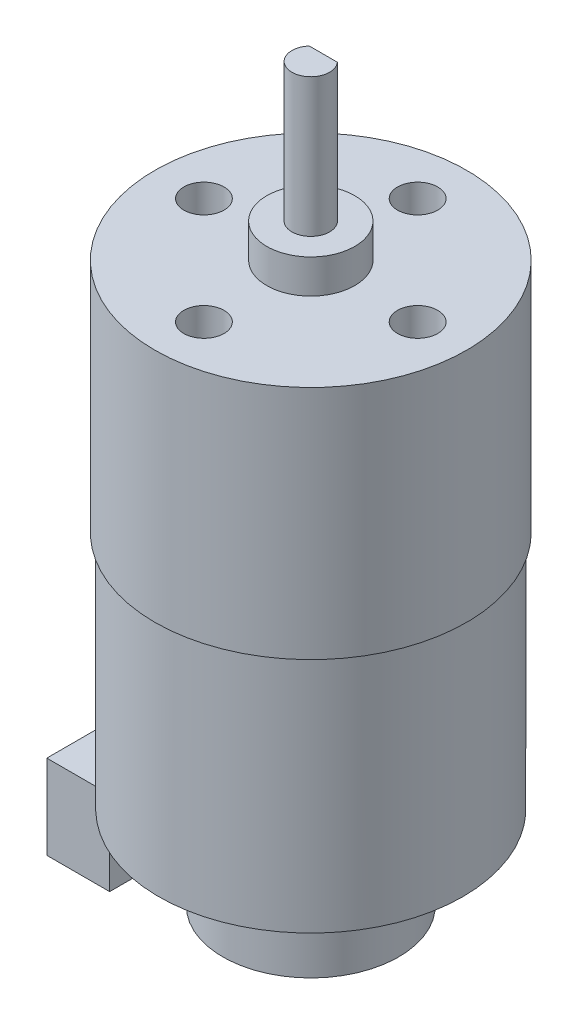
ISO-10303-21;
HEADER;
FILE_DESCRIPTION(('STEP AP214'),'2;1');
FILE_NAME('part.step','',(''),(''),'','','');
FILE_SCHEMA(('AUTOMOTIVE_DESIGN { 1 0 10303 214 1 1 1 1 }'));
ENDSEC;
DATA;
#1=APPLICATION_CONTEXT('core data for automotive mechanical design processes');
#2=APPLICATION_PROTOCOL_DEFINITION('international standard','automotive_design',2000,#1);
#3=PRODUCT_CONTEXT('',#1,'mechanical');
#4=PRODUCT('Part','Part','',(#3));
#5=PRODUCT_RELATED_PRODUCT_CATEGORY('part','',(#4));
#6=PRODUCT_DEFINITION_FORMATION('','',#4);
#7=PRODUCT_DEFINITION_CONTEXT('part definition',#1,'design');
#8=PRODUCT_DEFINITION('design','',#6,#7);
#9=PRODUCT_DEFINITION_SHAPE('','',#8);
#10=(LENGTH_UNIT() NAMED_UNIT(*) SI_UNIT(.MILLI.,.METRE.));
#11=(NAMED_UNIT(*) PLANE_ANGLE_UNIT() SI_UNIT($,.RADIAN.));
#12=(NAMED_UNIT(*) SI_UNIT($,.STERADIAN.) SOLID_ANGLE_UNIT());
#13=UNCERTAINTY_MEASURE_WITH_UNIT(LENGTH_MEASURE(1.E-05),#10,'distance_accuracy_value','');
#14=(GEOMETRIC_REPRESENTATION_CONTEXT(3) GLOBAL_UNCERTAINTY_ASSIGNED_CONTEXT((#13)) GLOBAL_UNIT_ASSIGNED_CONTEXT((#10,
#11,#12)) REPRESENTATION_CONTEXT('',''));
#15=CARTESIAN_POINT('',(0.,0.,0.));
#16=DIRECTION('',(0.,0.,1.));
#17=DIRECTION('',(1.,0.,0.));
#18=AXIS2_PLACEMENT_3D('',#15,#16,#17);
#19=CARTESIAN_POINT('',(0.,0.,0.));
#20=DIRECTION('',(0.,1.,0.));
#21=DIRECTION('',(0.,0.,1.));
#22=AXIS2_PLACEMENT_3D('',#19,#20,#21);
#23=PLANE('',#22);
#24=CARTESIAN_POINT('',(0.,0.,0.));
#25=DIRECTION('',(0.,-1.,0.));
#26=DIRECTION('',(0.,0.,-1.));
#27=AXIS2_PLACEMENT_3D('',#24,#25,#26);
#28=CIRCLE('',#27,7.);
#29=CARTESIAN_POINT('',(0.,0.,-7.));
#30=VERTEX_POINT('',#29);
#31=EDGE_CURVE('E12',#30,#30,#28,.T.);
#32=ORIENTED_EDGE('',*,*,#31,.F.);
#33=EDGE_LOOP('',(#32));
#34=FACE_BOUND('',#33,.T.);
#35=DIRECTION('',(1.,0.,0.));
#36=VECTOR('',#35,1.);
#37=CARTESIAN_POINT('',(-9.,0.,-7.));
#38=LINE('',#37,#36);
#39=CARTESIAN_POINT('',(-9.86965044973731,0.,-7.));
#40=VERTEX_POINT('',#39);
#41=CARTESIAN_POINT('',(-9.,0.,-7.));
#42=VERTEX_POINT('',#41);
#43=EDGE_CURVE('E427',#40,#42,#38,.T.);
#44=ORIENTED_EDGE('',*,*,#43,.F.);
#45=CARTESIAN_POINT('',(0.,0.,0.));
#46=DIRECTION('',(0.,1.,0.));
#47=DIRECTION('',(0.,0.,1.));
#48=AXIS2_PLACEMENT_3D('',#45,#46,#47);
#49=CIRCLE('',#48,12.1);
#50=CARTESIAN_POINT('',(-9.86965044973732,0.,7.));
#51=VERTEX_POINT('',#50);
#52=EDGE_CURVE('E215',#51,#40,#49,.T.);
#53=ORIENTED_EDGE('',*,*,#52,.F.);
#54=DIRECTION('',(-1.,0.,0.));
#55=VECTOR('',#54,1.);
#56=CARTESIAN_POINT('',(-9.,0.,7.));
#57=LINE('',#56,#55);
#58=CARTESIAN_POINT('',(-9.,0.,7.));
#59=VERTEX_POINT('',#58);
#60=EDGE_CURVE('E87',#59,#51,#57,.T.);
#61=ORIENTED_EDGE('',*,*,#60,.F.);
#62=DIRECTION('',(0.,0.,1.));
#63=VECTOR('',#62,1.);
#64=CARTESIAN_POINT('',(-9.,0.,-7.));
#65=LINE('',#64,#63);
#66=EDGE_CURVE('E422',#42,#59,#65,.T.);
#67=ORIENTED_EDGE('',*,*,#66,.F.);
#68=EDGE_LOOP('',(#44,#53,#61,#67));
#69=FACE_BOUND('',#68,.T.);
#70=ADVANCED_FACE('F71',(#34,#69),#23,.F.);
#71=CARTESIAN_POINT('',(0.,19.05,0.));
#72=DIRECTION('',(0.,-1.,0.));
#73=DIRECTION('',(0.,0.,-1.));
#74=AXIS2_PLACEMENT_3D('',#71,#72,#73);
#75=CYLINDRICAL_SURFACE('',#74,12.1);
#76=CARTESIAN_POINT('',(0.,19.05,0.));
#77=DIRECTION('',(0.,1.,0.));
#78=DIRECTION('',(0.,0.,1.));
#79=AXIS2_PLACEMENT_3D('',#76,#77,#78);
#80=CIRCLE('',#79,12.1);
#81=CARTESIAN_POINT('',(0.,19.05,12.1));
#82=VERTEX_POINT('',#81);
#83=EDGE_CURVE('E211',#82,#82,#80,.T.);
#84=ORIENTED_EDGE('',*,*,#83,.F.);
#85=EDGE_LOOP('',(#84));
#86=FACE_BOUND('',#85,.T.);
#87=EDGE_CURVE('E220',#40,#51,#49,.T.);
#88=ORIENTED_EDGE('',*,*,#87,.T.);
#89=ORIENTED_EDGE('',*,*,#52,.T.);
#90=EDGE_LOOP('',(#88,#89));
#91=FACE_BOUND('',#90,.T.);
#92=ADVANCED_FACE('F73',(#86,#91),#75,.T.);
#93=CARTESIAN_POINT('',(0.,37.8,0.));
#94=DIRECTION('',(0.,-1.,0.));
#95=DIRECTION('',(0.,0.,-1.));
#96=AXIS2_PLACEMENT_3D('',#93,#94,#95);
#97=CYLINDRICAL_SURFACE('',#96,12.4);
#98=CARTESIAN_POINT('',(0.,37.8,0.));
#99=DIRECTION('',(0.,1.,0.));
#100=DIRECTION('',(0.,0.,1.));
#101=AXIS2_PLACEMENT_3D('',#98,#99,#100);
#102=CIRCLE('',#101,12.4);
#103=CARTESIAN_POINT('',(0.,37.8,12.4));
#104=VERTEX_POINT('',#103);
#105=EDGE_CURVE('E212',#104,#104,#102,.T.);
#106=ORIENTED_EDGE('',*,*,#105,.F.);
#107=EDGE_LOOP('',(#106));
#108=FACE_BOUND('',#107,.T.);
#109=CARTESIAN_POINT('',(0.,19.05,0.));
#110=DIRECTION('',(0.,1.,0.));
#111=DIRECTION('',(0.,0.,1.));
#112=AXIS2_PLACEMENT_3D('',#109,#110,#111);
#113=CIRCLE('',#112,12.4);
#114=CARTESIAN_POINT('',(0.,19.05,12.4));
#115=VERTEX_POINT('',#114);
#116=EDGE_CURVE('E208',#115,#115,#113,.T.);
#117=ORIENTED_EDGE('',*,*,#116,.T.);
#118=EDGE_LOOP('',(#117));
#119=FACE_BOUND('',#118,.T.);
#120=ADVANCED_FACE('F249',(#108,#119),#97,.T.);
#121=CARTESIAN_POINT('',(0.,37.8,0.));
#122=DIRECTION('',(0.,1.,0.));
#123=DIRECTION('',(0.,0.,1.));
#124=AXIS2_PLACEMENT_3D('',#121,#122,#123);
#125=PLANE('',#124);
#126=CARTESIAN_POINT('',(0.,37.8,-8.5));
#127=DIRECTION('',(0.,1.,0.));
#128=DIRECTION('',(0.,0.,1.));
#129=AXIS2_PLACEMENT_3D('',#126,#127,#128);
#130=CIRCLE('',#129,1.6);
#131=CARTESIAN_POINT('',(0.,37.8,-6.9));
#132=VERTEX_POINT('',#131);
#133=EDGE_CURVE('E178',#132,#132,#130,.T.);
#134=ORIENTED_EDGE('',*,*,#133,.F.);
#135=EDGE_LOOP('',(#134));
#136=FACE_BOUND('',#135,.T.);
#137=CARTESIAN_POINT('',(-8.49999999999976,37.8,2.41064055268796E-13));
#138=DIRECTION('',(0.,1.,0.));
#139=DIRECTION('',(0.,0.,1.));
#140=AXIS2_PLACEMENT_3D('',#137,#138,#139);
#141=CIRCLE('',#140,1.60000000000039);
#142=CARTESIAN_POINT('',(-8.49999999999976,37.8,1.60000000000063));
#143=VERTEX_POINT('',#142);
#144=EDGE_CURVE('E181',#143,#143,#141,.T.);
#145=ORIENTED_EDGE('',*,*,#144,.F.);
#146=EDGE_LOOP('',(#145));
#147=FACE_BOUND('',#146,.T.);
#148=CARTESIAN_POINT('',(4.80046210979042E-13,37.8,8.5));
#149=DIRECTION('',(0.,1.,0.));
#150=DIRECTION('',(0.,0.,1.));
#151=AXIS2_PLACEMENT_3D('',#148,#149,#150);
#152=CIRCLE('',#151,1.60000000000052);
#153=CARTESIAN_POINT('',(4.80046210979042E-13,37.8,10.1000000000005));
#154=VERTEX_POINT('',#153);
#155=EDGE_CURVE('E187',#154,#154,#152,.T.);
#156=ORIENTED_EDGE('',*,*,#155,.F.);
#157=EDGE_LOOP('',(#156));
#158=FACE_BOUND('',#157,.T.);
#159=CARTESIAN_POINT('',(8.50000000000024,37.8,-2.40023105489521E-13));
#160=DIRECTION('',(0.,1.,0.));
#161=DIRECTION('',(0.,0.,1.));
#162=AXIS2_PLACEMENT_3D('',#159,#160,#161);
#163=CIRCLE('',#162,1.60000000000019);
#164=CARTESIAN_POINT('',(8.50000000000024,37.8,1.59999999999995));
#165=VERTEX_POINT('',#164);
#166=EDGE_CURVE('E193',#165,#165,#163,.T.);
#167=ORIENTED_EDGE('',*,*,#166,.F.);
#168=EDGE_LOOP('',(#167));
#169=FACE_BOUND('',#168,.T.);
#170=CARTESIAN_POINT('',(0.,37.8,0.));
#171=DIRECTION('',(0.,1.,0.));
#172=DIRECTION('',(0.,0.,1.));
#173=AXIS2_PLACEMENT_3D('',#170,#171,#172);
#174=CIRCLE('',#173,3.5);
#175=CARTESIAN_POINT('',(0.,37.8,-3.5));
#176=VERTEX_POINT('',#175);
#177=EDGE_CURVE('E205',#176,#176,#174,.T.);
#178=ORIENTED_EDGE('',*,*,#177,.F.);
#179=EDGE_LOOP('',(#178));
#180=FACE_BOUND('',#179,.T.);
#181=ORIENTED_EDGE('',*,*,#105,.T.);
#182=EDGE_LOOP('',(#181));
#183=FACE_BOUND('',#182,.T.);
#184=ADVANCED_FACE('F256',(#136,#147,#158,#169,#180,#183),#125,.T.);
#185=CARTESIAN_POINT('',(0.,19.05,0.));
#186=DIRECTION('',(0.,1.,0.));
#187=DIRECTION('',(0.,0.,1.));
#188=AXIS2_PLACEMENT_3D('',#185,#186,#187);
#189=PLANE('',#188);
#190=ORIENTED_EDGE('',*,*,#83,.T.);
#191=EDGE_LOOP('',(#190));
#192=FACE_BOUND('',#191,.T.);
#193=ORIENTED_EDGE('',*,*,#116,.F.);
#194=EDGE_LOOP('',(#193));
#195=FACE_BOUND('',#194,.T.);
#196=ADVANCED_FACE('F258',(#192,#195),#189,.F.);
#197=CARTESIAN_POINT('',(0.,40.5,0.));
#198=DIRECTION('',(0.,-1.,0.));
#199=DIRECTION('',(0.,0.,-1.));
#200=AXIS2_PLACEMENT_3D('',#197,#198,#199);
#201=CYLINDRICAL_SURFACE('',#200,3.5);
#202=CARTESIAN_POINT('',(0.,40.5,0.));
#203=DIRECTION('',(0.,1.,0.));
#204=DIRECTION('',(0.,0.,1.));
#205=AXIS2_PLACEMENT_3D('',#202,#203,#204);
#206=CIRCLE('',#205,3.5);
#207=CARTESIAN_POINT('',(0.,40.5,-3.5));
#208=VERTEX_POINT('',#207);
#209=EDGE_CURVE('E200',#208,#208,#206,.T.);
#210=CARTESIAN_POINT('',(0.,40.5,-3.5));
#211=CARTESIAN_POINT('',(0.,40.471875,-3.5));
#212=CARTESIAN_POINT('',(0.,40.44375,-3.5));
#213=CARTESIAN_POINT('',(0.,40.3875,-3.5));
#214=CARTESIAN_POINT('',(0.,40.359375,-3.5));
#215=CARTESIAN_POINT('',(0.,40.303125,-3.5));
#216=CARTESIAN_POINT('',(0.,40.275,-3.5));
#217=CARTESIAN_POINT('',(0.,40.21875,-3.5));
#218=CARTESIAN_POINT('',(0.,40.190625,-3.5));
#219=CARTESIAN_POINT('',(0.,40.134375,-3.5));
#220=CARTESIAN_POINT('',(0.,40.10625,-3.5));
#221=CARTESIAN_POINT('',(0.,40.05,-3.5));
#222=CARTESIAN_POINT('',(0.,40.021875,-3.5));
#223=CARTESIAN_POINT('',(0.,39.965625,-3.5));
#224=CARTESIAN_POINT('',(0.,39.9375,-3.5));
#225=CARTESIAN_POINT('',(0.,39.88125,-3.5));
#226=CARTESIAN_POINT('',(0.,39.853125,-3.5));
#227=CARTESIAN_POINT('',(0.,39.796875,-3.5));
#228=CARTESIAN_POINT('',(0.,39.76875,-3.5));
#229=CARTESIAN_POINT('',(0.,39.7125,-3.5));
#230=CARTESIAN_POINT('',(0.,39.684375,-3.5));
#231=CARTESIAN_POINT('',(0.,39.628125,-3.5));
#232=CARTESIAN_POINT('',(0.,39.6,-3.5));
#233=CARTESIAN_POINT('',(0.,39.54375,-3.5));
#234=CARTESIAN_POINT('',(0.,39.515625,-3.5));
#235=CARTESIAN_POINT('',(0.,39.459375,-3.5));
#236=CARTESIAN_POINT('',(0.,39.43125,-3.5));
#237=CARTESIAN_POINT('',(0.,39.375,-3.5));
#238=CARTESIAN_POINT('',(0.,39.346875,-3.5));
#239=CARTESIAN_POINT('',(0.,39.290625,-3.5));
#240=CARTESIAN_POINT('',(0.,39.2625,-3.5));
#241=CARTESIAN_POINT('',(0.,39.20625,-3.5));
#242=CARTESIAN_POINT('',(0.,39.178125,-3.5));
#243=CARTESIAN_POINT('',(0.,39.121875,-3.5));
#244=CARTESIAN_POINT('',(0.,39.09375,-3.5));
#245=CARTESIAN_POINT('',(0.,39.0375,-3.5));
#246=CARTESIAN_POINT('',(0.,39.009375,-3.5));
#247=CARTESIAN_POINT('',(0.,38.953125,-3.5));
#248=CARTESIAN_POINT('',(0.,38.925,-3.5));
#249=CARTESIAN_POINT('',(0.,38.86875,-3.5));
#250=CARTESIAN_POINT('',(0.,38.840625,-3.5));
#251=CARTESIAN_POINT('',(0.,38.784375,-3.5));
#252=CARTESIAN_POINT('',(0.,38.75625,-3.5));
#253=CARTESIAN_POINT('',(0.,38.7,-3.5));
#254=CARTESIAN_POINT('',(0.,38.671875,-3.5));
#255=CARTESIAN_POINT('',(0.,38.615625,-3.5));
#256=CARTESIAN_POINT('',(0.,38.5875,-3.5));
#257=CARTESIAN_POINT('',(0.,38.53125,-3.5));
#258=CARTESIAN_POINT('',(0.,38.503125,-3.5));
#259=CARTESIAN_POINT('',(0.,38.446875,-3.5));
#260=CARTESIAN_POINT('',(0.,38.41875,-3.5));
#261=CARTESIAN_POINT('',(0.,38.3625,-3.5));
#262=CARTESIAN_POINT('',(0.,38.334375,-3.5));
#263=CARTESIAN_POINT('',(0.,38.278125,-3.5));
#264=CARTESIAN_POINT('',(0.,38.25,-3.5));
#265=CARTESIAN_POINT('',(0.,38.19375,-3.5));
#266=CARTESIAN_POINT('',(0.,38.165625,-3.5));
#267=CARTESIAN_POINT('',(0.,38.109375,-3.5));
#268=CARTESIAN_POINT('',(0.,38.08125,-3.5));
#269=CARTESIAN_POINT('',(0.,38.025,-3.5));
#270=CARTESIAN_POINT('',(0.,37.996875,-3.5));
#271=CARTESIAN_POINT('',(0.,37.940625,-3.5));
#272=CARTESIAN_POINT('',(0.,37.9125,-3.5));
#273=CARTESIAN_POINT('',(0.,37.85625,-3.5));
#274=CARTESIAN_POINT('',(0.,37.828125,-3.5));
#275=CARTESIAN_POINT('',(0.,37.8,-3.5));
#276=B_SPLINE_CURVE_WITH_KNOTS('',3,(#210,#211,#212,#213,#214,#215,#216,#217,#218,#219,#220,
#221,#222,#223,#224,#225,#226,#227,#228,#229,#230,#231,#232,#233,#234,#235,#236,#237,#238,#239,
#240,#241,#242,#243,#244,#245,#246,#247,#248,#249,#250,#251,#252,#253,#254,#255,#256,#257,#258,
#259,#260,#261,#262,#263,#264,#265,#266,#267,#268,#269,#270,#271,#272,#273,#274,#275),
.UNSPECIFIED.,.F.,.F.,(4,2,2,2,2,2,2,2,2,2,2,2,2,2,2,2,2,2,2,2,2,2,2,2,2,2,2,2,2,2,2,2,4),(0.,
0.0843750000000046,0.168750000000002,0.253125000000007,0.337500000000004,0.421875000000002,
0.506250000000007,0.590625000000004,0.675000000000002,0.759375000000007,0.843750000000004,
0.928125000000002,1.01250000000001,1.096875,1.18125,1.26562500000001,1.35,1.434375,
1.51875000000001,1.603125,1.6875,1.77187500000001,1.85625,1.940625,2.02500000000001,2.109375,
2.19375,2.27812500000001,2.3625,2.44687500000001,2.53125000000001,2.615625,2.70000000000001),.UNSPECIFIED.);
#277=EDGE_CURVE('BSEAM261',#208,#176,#276,.T.);
#278=ORIENTED_EDGE('',*,*,#209,.F.);
#279=ORIENTED_EDGE('',*,*,#177,.T.);
#280=ORIENTED_EDGE('',*,*,#277,.T.);
#281=ORIENTED_EDGE('',*,*,#277,.F.);
#282=EDGE_LOOP('',(#278,#280,#279,#281));
#283=FACE_BOUND('',#282,.T.);
#284=ADVANCED_FACE('F261',(#283),#201,.T.);
#285=CARTESIAN_POINT('',(0.,40.5,0.));
#286=DIRECTION('',(0.,1.,0.));
#287=DIRECTION('',(0.,0.,1.));
#288=AXIS2_PLACEMENT_3D('',#285,#286,#287);
#289=PLANE('',#288);
#290=CARTESIAN_POINT('',(0.,40.5,0.));
#291=DIRECTION('',(0.,1.,0.));
#292=DIRECTION('',(0.,0.,1.));
#293=AXIS2_PLACEMENT_3D('',#290,#291,#292);
#294=CIRCLE('',#293,1.5);
#295=CARTESIAN_POINT('',(0.,40.5,1.5));
#296=VERTEX_POINT('',#295);
#297=EDGE_CURVE('E201',#296,#296,#294,.T.);
#298=ORIENTED_EDGE('',*,*,#297,.F.);
#299=EDGE_LOOP('',(#298));
#300=FACE_BOUND('',#299,.T.);
#301=ORIENTED_EDGE('',*,*,#209,.T.);
#302=EDGE_LOOP('',(#301));
#303=FACE_BOUND('',#302,.T.);
#304=ADVANCED_FACE('F268',(#300,#303),#289,.T.);
#305=CARTESIAN_POINT('',(0.,51.5,0.));
#306=DIRECTION('',(0.,-1.,0.));
#307=DIRECTION('',(0.,0.,-1.));
#308=AXIS2_PLACEMENT_3D('',#305,#306,#307);
#309=CYLINDRICAL_SURFACE('',#308,1.5);
#310=CARTESIAN_POINT('',(0.,51.5,0.));
#311=DIRECTION('',(0.,1.,0.));
#312=DIRECTION('',(0.,0.,1.));
#313=AXIS2_PLACEMENT_3D('',#310,#311,#312);
#314=CIRCLE('',#313,1.5);
#315=CARTESIAN_POINT('',(-1.1180339887499,51.5,-1.));
#316=VERTEX_POINT('',#315);
#317=CARTESIAN_POINT('',(1.1180339887499,51.5,-1.));
#318=VERTEX_POINT('',#317);
#319=EDGE_CURVE('E177',#316,#318,#314,.T.);
#320=ORIENTED_EDGE('',*,*,#319,.F.);
#321=DIRECTION('',(0.,-1.,0.));
#322=VECTOR('',#321,1.);
#323=CARTESIAN_POINT('',(-1.1180339887499,51.5,-1.));
#324=LINE('',#323,#322);
#325=CARTESIAN_POINT('',(-1.1180339887499,43.5,-1.));
#326=VERTEX_POINT('',#325);
#327=EDGE_CURVE('E95',#316,#326,#324,.T.);
#328=ORIENTED_EDGE('',*,*,#327,.T.);
#329=CARTESIAN_POINT('',(0.,43.5,0.));
#330=DIRECTION('',(0.,-1.,0.));
#331=DIRECTION('',(0.,0.,-1.));
#332=AXIS2_PLACEMENT_3D('',#329,#330,#331);
#333=CIRCLE('',#332,1.5);
#334=CARTESIAN_POINT('',(1.1180339887499,43.5,-1.));
#335=VERTEX_POINT('',#334);
#336=EDGE_CURVE('E75',#326,#335,#333,.T.);
#337=ORIENTED_EDGE('',*,*,#336,.T.);
#338=DIRECTION('',(0.,-1.,0.));
#339=VECTOR('',#338,1.);
#340=CARTESIAN_POINT('',(1.1180339887499,51.5,-1.));
#341=LINE('',#340,#339);
#342=EDGE_CURVE('E169',#335,#318,#341,.F.);
#343=ORIENTED_EDGE('',*,*,#342,.T.);
#344=EDGE_LOOP('',(#320,#328,#337,#343));
#345=FACE_BOUND('',#344,.T.);
#346=ORIENTED_EDGE('',*,*,#297,.T.);
#347=EDGE_LOOP('',(#346));
#348=FACE_BOUND('',#347,.T.);
#349=ADVANCED_FACE('F225',(#345,#348),#309,.T.);
#350=CARTESIAN_POINT('',(0.,51.5,0.));
#351=DIRECTION('',(0.,1.,0.));
#352=DIRECTION('',(0.,0.,1.));
#353=AXIS2_PLACEMENT_3D('',#350,#351,#352);
#354=PLANE('',#353);
#355=DIRECTION('',(1.,0.,0.));
#356=VECTOR('',#355,1.);
#357=CARTESIAN_POINT('',(0.,51.5,-1.));
#358=LINE('',#357,#356);
#359=EDGE_CURVE('E204',#316,#318,#358,.T.);
#360=ORIENTED_EDGE('',*,*,#359,.F.);
#361=ORIENTED_EDGE('',*,*,#319,.T.);
#362=EDGE_LOOP('',(#360,#361));
#363=FACE_BOUND('',#362,.T.);
#364=ADVANCED_FACE('F275',(#363),#354,.T.);
#365=CARTESIAN_POINT('',(8.50000000000024,30.8,-2.40023105489521E-13));
#366=DIRECTION('',(0.,1.,0.));
#367=DIRECTION('',(0.,0.,1.));
#368=AXIS2_PLACEMENT_3D('',#365,#366,#367);
#369=CYLINDRICAL_SURFACE('',#368,1.60000000000019);
#370=CARTESIAN_POINT('',(8.50000000000024,30.8,-2.40023105489521E-13));
#371=DIRECTION('',(0.,1.,0.));
#372=DIRECTION('',(0.,0.,1.));
#373=AXIS2_PLACEMENT_3D('',#370,#371,#372);
#374=CIRCLE('',#373,1.60000000000019);
#375=CARTESIAN_POINT('',(8.50000000000024,30.8,1.59999999999995));
#376=VERTEX_POINT('',#375);
#377=EDGE_CURVE('E173',#376,#376,#374,.T.);
#378=ORIENTED_EDGE('',*,*,#377,.F.);
#379=EDGE_LOOP('',(#378));
#380=FACE_BOUND('',#379,.T.);
#381=ORIENTED_EDGE('',*,*,#166,.T.);
#382=EDGE_LOOP('',(#381));
#383=FACE_BOUND('',#382,.T.);
#384=ADVANCED_FACE('F278',(#380,#383),#369,.F.);
#385=CARTESIAN_POINT('',(8.50000000000024,30.8,-2.40023105489521E-13));
#386=DIRECTION('',(0.,1.,0.));
#387=DIRECTION('',(0.,0.,1.));
#388=AXIS2_PLACEMENT_3D('',#385,#386,#387);
#389=PLANE('',#388);
#390=ORIENTED_EDGE('',*,*,#377,.T.);
#391=EDGE_LOOP('',(#390));
#392=FACE_BOUND('',#391,.T.);
#393=ADVANCED_FACE('F280',(#392),#389,.T.);
#394=CARTESIAN_POINT('',(4.80046210979042E-13,30.8,8.5));
#395=DIRECTION('',(0.,1.,0.));
#396=DIRECTION('',(0.,0.,1.));
#397=AXIS2_PLACEMENT_3D('',#394,#395,#396);
#398=CYLINDRICAL_SURFACE('',#397,1.60000000000052);
#399=CARTESIAN_POINT('',(4.80046210979042E-13,30.8,8.5));
#400=DIRECTION('',(0.,1.,0.));
#401=DIRECTION('',(0.,0.,1.));
#402=AXIS2_PLACEMENT_3D('',#399,#400,#401);
#403=CIRCLE('',#402,1.60000000000052);
#404=CARTESIAN_POINT('',(4.80046210979042E-13,30.8,10.1000000000005));
#405=VERTEX_POINT('',#404);
#406=EDGE_CURVE('E190',#405,#405,#403,.T.);
#407=ORIENTED_EDGE('',*,*,#406,.F.);
#408=EDGE_LOOP('',(#407));
#409=FACE_BOUND('',#408,.T.);
#410=ORIENTED_EDGE('',*,*,#155,.T.);
#411=EDGE_LOOP('',(#410));
#412=FACE_BOUND('',#411,.T.);
#413=ADVANCED_FACE('F283',(#409,#412),#398,.F.);
#414=CARTESIAN_POINT('',(4.80046210979042E-13,30.8,8.5));
#415=DIRECTION('',(0.,1.,0.));
#416=DIRECTION('',(0.,0.,1.));
#417=AXIS2_PLACEMENT_3D('',#414,#415,#416);
#418=PLANE('',#417);
#419=ORIENTED_EDGE('',*,*,#406,.T.);
#420=EDGE_LOOP('',(#419));
#421=FACE_BOUND('',#420,.T.);
#422=ADVANCED_FACE('F288',(#421),#418,.T.);
#423=CARTESIAN_POINT('',(-8.49999999999976,30.8,2.41064055268796E-13));
#424=DIRECTION('',(0.,1.,0.));
#425=DIRECTION('',(0.,0.,1.));
#426=AXIS2_PLACEMENT_3D('',#423,#424,#425);
#427=CYLINDRICAL_SURFACE('',#426,1.60000000000039);
#428=CARTESIAN_POINT('',(-8.49999999999976,30.8,2.41064055268796E-13));
#429=DIRECTION('',(0.,1.,0.));
#430=DIRECTION('',(0.,0.,1.));
#431=AXIS2_PLACEMENT_3D('',#428,#429,#430);
#432=CIRCLE('',#431,1.60000000000039);
#433=CARTESIAN_POINT('',(-8.49999999999976,30.8,1.60000000000063));
#434=VERTEX_POINT('',#433);
#435=EDGE_CURVE('E184',#434,#434,#432,.T.);
#436=ORIENTED_EDGE('',*,*,#435,.F.);
#437=EDGE_LOOP('',(#436));
#438=FACE_BOUND('',#437,.T.);
#439=ORIENTED_EDGE('',*,*,#144,.T.);
#440=EDGE_LOOP('',(#439));
#441=FACE_BOUND('',#440,.T.);
#442=ADVANCED_FACE('F291',(#438,#441),#427,.F.);
#443=CARTESIAN_POINT('',(-8.49999999999976,30.8,2.41064055268796E-13));
#444=DIRECTION('',(0.,1.,0.));
#445=DIRECTION('',(0.,0.,1.));
#446=AXIS2_PLACEMENT_3D('',#443,#444,#445);
#447=PLANE('',#446);
#448=ORIENTED_EDGE('',*,*,#435,.T.);
#449=EDGE_LOOP('',(#448));
#450=FACE_BOUND('',#449,.T.);
#451=ADVANCED_FACE('F296',(#450),#447,.T.);
#452=CARTESIAN_POINT('',(0.,30.8,-8.5));
#453=DIRECTION('',(0.,1.,0.));
#454=DIRECTION('',(0.,0.,1.));
#455=AXIS2_PLACEMENT_3D('',#452,#453,#454);
#456=CYLINDRICAL_SURFACE('',#455,1.6);
#457=CARTESIAN_POINT('',(0.,30.8,-8.5));
#458=DIRECTION('',(0.,1.,0.));
#459=DIRECTION('',(0.,0.,1.));
#460=AXIS2_PLACEMENT_3D('',#457,#458,#459);
#461=CIRCLE('',#460,1.6);
#462=CARTESIAN_POINT('',(0.,30.8,-6.9));
#463=VERTEX_POINT('',#462);
#464=EDGE_CURVE('E174',#463,#463,#461,.T.);
#465=ORIENTED_EDGE('',*,*,#464,.F.);
#466=EDGE_LOOP('',(#465));
#467=FACE_BOUND('',#466,.T.);
#468=ORIENTED_EDGE('',*,*,#133,.T.);
#469=EDGE_LOOP('',(#468));
#470=FACE_BOUND('',#469,.T.);
#471=ADVANCED_FACE('F299',(#467,#470),#456,.F.);
#472=CARTESIAN_POINT('',(0.,30.8,-8.5));
#473=DIRECTION('',(0.,1.,0.));
#474=DIRECTION('',(0.,0.,1.));
#475=AXIS2_PLACEMENT_3D('',#472,#473,#474);
#476=PLANE('',#475);
#477=ORIENTED_EDGE('',*,*,#464,.T.);
#478=EDGE_LOOP('',(#477));
#479=FACE_BOUND('',#478,.T.);
#480=ADVANCED_FACE('F241',(#479),#476,.T.);
#481=CARTESIAN_POINT('',(0.,43.5,0.));
#482=DIRECTION('',(0.,-1.,0.));
#483=DIRECTION('',(0.,0.,-1.));
#484=AXIS2_PLACEMENT_3D('',#481,#482,#483);
#485=PLANE('',#484);
#486=DIRECTION('',(1.,0.,0.));
#487=VECTOR('',#486,1.);
#488=CARTESIAN_POINT('',(-2.56178423388724,43.5,-1.));
#489=LINE('',#488,#487);
#490=EDGE_CURVE('E161',#326,#335,#489,.T.);
#491=ORIENTED_EDGE('',*,*,#490,.T.);
#492=ORIENTED_EDGE('',*,*,#336,.F.);
#493=EDGE_LOOP('',(#491,#492));
#494=FACE_BOUND('',#493,.T.);
#495=ADVANCED_FACE('F228',(#494),#485,.F.);
#496=CARTESIAN_POINT('',(-2.56178423388724,43.5,-1.));
#497=DIRECTION('',(0.,0.,1.));
#498=DIRECTION('',(1.,0.,0.));
#499=AXIS2_PLACEMENT_3D('',#496,#497,#498);
#500=PLANE('',#499);
#501=ORIENTED_EDGE('',*,*,#359,.T.);
#502=ORIENTED_EDGE('',*,*,#342,.F.);
#503=ORIENTED_EDGE('',*,*,#490,.F.);
#504=ORIENTED_EDGE('',*,*,#327,.F.);
#505=EDGE_LOOP('',(#501,#502,#503,#504));
#506=FACE_BOUND('',#505,.T.);
#507=ADVANCED_FACE('F229',(#506),#500,.F.);
#508=CARTESIAN_POINT('',(0.,-6.7,0.));
#509=DIRECTION('',(0.,1.,0.));
#510=DIRECTION('',(0.,0.,1.));
#511=AXIS2_PLACEMENT_3D('',#508,#509,#510);
#512=CYLINDRICAL_SURFACE('',#511,7.);
#513=CARTESIAN_POINT('',(0.,-6.7,0.));
#514=DIRECTION('',(0.,-1.,0.));
#515=DIRECTION('',(0.,0.,-1.));
#516=AXIS2_PLACEMENT_3D('',#513,#514,#515);
#517=CIRCLE('',#516,7.);
#518=CARTESIAN_POINT('',(0.,-6.7,-7.));
#519=VERTEX_POINT('',#518);
#520=EDGE_CURVE('E158',#519,#519,#517,.T.);
#521=ORIENTED_EDGE('',*,*,#520,.F.);
#522=EDGE_LOOP('',(#521));
#523=FACE_BOUND('',#522,.T.);
#524=ORIENTED_EDGE('',*,*,#31,.T.);
#525=EDGE_LOOP('',(#524));
#526=FACE_BOUND('',#525,.T.);
#527=ADVANCED_FACE('F231',(#523,#526),#512,.T.);
#528=CARTESIAN_POINT('',(0.,-6.7,0.));
#529=DIRECTION('',(0.,-1.,0.));
#530=DIRECTION('',(0.,0.,-1.));
#531=AXIS2_PLACEMENT_3D('',#528,#529,#530);
#532=PLANE('',#531);
#533=ORIENTED_EDGE('',*,*,#520,.T.);
#534=EDGE_LOOP('',(#533));
#535=FACE_BOUND('',#534,.T.);
#536=ADVANCED_FACE('F238',(#535),#532,.T.);
#537=CARTESIAN_POINT('',(-14.,-6.7,-7.));
#538=DIRECTION('',(1.,0.,0.));
#539=DIRECTION('',(0.,0.,-1.));
#540=AXIS2_PLACEMENT_3D('',#537,#538,#539);
#541=PLANE('',#540);
#542=DIRECTION('',(0.,0.,-1.));
#543=VECTOR('',#542,1.);
#544=CARTESIAN_POINT('',(-14.,0.,-7.));
#545=LINE('',#544,#543);
#546=CARTESIAN_POINT('',(-14.,0.,7.));
#547=VERTEX_POINT('',#546);
#548=CARTESIAN_POINT('',(-14.,0.,-7.));
#549=VERTEX_POINT('',#548);
#550=EDGE_CURVE('E157',#547,#549,#545,.T.);
#551=ORIENTED_EDGE('',*,*,#550,.T.);
#552=DIRECTION('',(0.,1.,0.));
#553=VECTOR('',#552,1.);
#554=CARTESIAN_POINT('',(-14.,-6.7,-7.));
#555=LINE('',#554,#553);
#556=CARTESIAN_POINT('',(-14.,-6.7,-7.));
#557=VERTEX_POINT('',#556);
#558=EDGE_CURVE('E138',#557,#549,#555,.T.);
#559=ORIENTED_EDGE('',*,*,#558,.F.);
#560=DIRECTION('',(0.,0.,-1.));
#561=VECTOR('',#560,1.);
#562=CARTESIAN_POINT('',(-14.,-6.7,-7.));
#563=LINE('',#562,#561);
#564=CARTESIAN_POINT('',(-14.,-6.7,7.));
#565=VERTEX_POINT('',#564);
#566=EDGE_CURVE('E145',#565,#557,#563,.T.);
#567=ORIENTED_EDGE('',*,*,#566,.F.);
#568=DIRECTION('',(0.,1.,0.));
#569=VECTOR('',#568,1.);
#570=CARTESIAN_POINT('',(-14.,-6.7,7.));
#571=LINE('',#570,#569);
#572=EDGE_CURVE('E435',#565,#547,#571,.T.);
#573=ORIENTED_EDGE('',*,*,#572,.T.);
#574=EDGE_LOOP('',(#551,#559,#567,#573));
#575=FACE_BOUND('',#574,.T.);
#576=ADVANCED_FACE('F155',(#575),#541,.F.);
#577=CARTESIAN_POINT('',(-9.,-6.7,-7.));
#578=DIRECTION('',(0.,0.,1.));
#579=DIRECTION('',(1.,0.,0.));
#580=AXIS2_PLACEMENT_3D('',#577,#578,#579);
#581=PLANE('',#580);
#582=EDGE_CURVE('E429',#549,#40,#38,.T.);
#583=ORIENTED_EDGE('',*,*,#582,.T.);
#584=ORIENTED_EDGE('',*,*,#43,.T.);
#585=DIRECTION('',(0.,1.,0.));
#586=VECTOR('',#585,1.);
#587=CARTESIAN_POINT('',(-9.,-6.7,-7.));
#588=LINE('',#587,#586);
#589=CARTESIAN_POINT('',(-9.,-6.7,-7.));
#590=VERTEX_POINT('',#589);
#591=EDGE_CURVE('E141',#590,#42,#588,.T.);
#592=ORIENTED_EDGE('',*,*,#591,.F.);
#593=DIRECTION('',(1.,0.,0.));
#594=VECTOR('',#593,1.);
#595=CARTESIAN_POINT('',(-9.,-6.7,-7.));
#596=LINE('',#595,#594);
#597=EDGE_CURVE('E133',#557,#590,#596,.T.);
#598=ORIENTED_EDGE('',*,*,#597,.F.);
#599=ORIENTED_EDGE('',*,*,#558,.T.);
#600=EDGE_LOOP('',(#583,#584,#592,#598,#599));
#601=FACE_BOUND('',#600,.T.);
#602=ADVANCED_FACE('F136',(#601),#581,.F.);
#603=CARTESIAN_POINT('',(-9.,-6.7,-7.));
#604=DIRECTION('',(-1.,0.,0.));
#605=DIRECTION('',(0.,0.,1.));
#606=AXIS2_PLACEMENT_3D('',#603,#604,#605);
#607=PLANE('',#606);
#608=ORIENTED_EDGE('',*,*,#66,.T.);
#609=DIRECTION('',(0.,1.,0.));
#610=VECTOR('',#609,1.);
#611=CARTESIAN_POINT('',(-9.,-6.7,7.));
#612=LINE('',#611,#610);
#613=CARTESIAN_POINT('',(-9.,-6.7,7.));
#614=VERTEX_POINT('',#613);
#615=EDGE_CURVE('E163',#614,#59,#612,.T.);
#616=ORIENTED_EDGE('',*,*,#615,.F.);
#617=DIRECTION('',(0.,0.,1.));
#618=VECTOR('',#617,1.);
#619=CARTESIAN_POINT('',(-9.,-6.7,-7.));
#620=LINE('',#619,#618);
#621=EDGE_CURVE('E144',#590,#614,#620,.T.);
#622=ORIENTED_EDGE('',*,*,#621,.F.);
#623=ORIENTED_EDGE('',*,*,#591,.T.);
#624=EDGE_LOOP('',(#608,#616,#622,#623));
#625=FACE_BOUND('',#624,.T.);
#626=ADVANCED_FACE('F378',(#625),#607,.F.);
#627=CARTESIAN_POINT('',(-9.,-6.7,7.));
#628=DIRECTION('',(0.,0.,-1.));
#629=DIRECTION('',(-1.,0.,0.));
#630=AXIS2_PLACEMENT_3D('',#627,#628,#629);
#631=PLANE('',#630);
#632=ORIENTED_EDGE('',*,*,#60,.T.);
#633=EDGE_CURVE('E420',#51,#547,#57,.T.);
#634=ORIENTED_EDGE('',*,*,#633,.T.);
#635=ORIENTED_EDGE('',*,*,#572,.F.);
#636=DIRECTION('',(-1.,0.,0.));
#637=VECTOR('',#636,1.);
#638=CARTESIAN_POINT('',(-9.,-6.7,7.));
#639=LINE('',#638,#637);
#640=EDGE_CURVE('E150',#614,#565,#639,.T.);
#641=ORIENTED_EDGE('',*,*,#640,.F.);
#642=ORIENTED_EDGE('',*,*,#615,.T.);
#643=EDGE_LOOP('',(#632,#634,#635,#641,#642));
#644=FACE_BOUND('',#643,.T.);
#645=ADVANCED_FACE('F386',(#644),#631,.F.);
#646=CARTESIAN_POINT('',(0.,-6.7,0.));
#647=DIRECTION('',(0.,-1.,0.));
#648=DIRECTION('',(0.,0.,-1.));
#649=AXIS2_PLACEMENT_3D('',#646,#647,#648);
#650=PLANE('',#649);
#651=ORIENTED_EDGE('',*,*,#566,.T.);
#652=ORIENTED_EDGE('',*,*,#597,.T.);
#653=ORIENTED_EDGE('',*,*,#621,.T.);
#654=ORIENTED_EDGE('',*,*,#640,.T.);
#655=EDGE_LOOP('',(#651,#652,#653,#654));
#656=FACE_BOUND('',#655,.T.);
#657=ADVANCED_FACE('F148',(#656),#650,.T.);
#658=CARTESIAN_POINT('',(0.,0.,0.));
#659=DIRECTION('',(0.,-1.,0.));
#660=DIRECTION('',(0.,0.,-1.));
#661=AXIS2_PLACEMENT_3D('',#658,#659,#660);
#662=PLANE('',#661);
#663=ORIENTED_EDGE('',*,*,#633,.F.);
#664=ORIENTED_EDGE('',*,*,#87,.F.);
#665=ORIENTED_EDGE('',*,*,#582,.F.);
#666=ORIENTED_EDGE('',*,*,#550,.F.);
#667=EDGE_LOOP('',(#663,#664,#665,#666));
#668=FACE_BOUND('',#667,.T.);
#669=ADVANCED_FACE('F402',(#668),#662,.F.);
#670=CLOSED_SHELL('',(#70,#92,#120,#184,#196,#284,#304,#349,#364,#384,#393,#413,#422,#442,#451,
#471,#480,#495,#507,#527,#536,#576,#602,#626,#645,#657,#669));
#671=MANIFOLD_SOLID_BREP('B2',#670);
#672=ADVANCED_BREP_SHAPE_REPRESENTATION('',(#18,#671),#14);
#673=SHAPE_DEFINITION_REPRESENTATION(#9,#672);
ENDSEC;
END-ISO-10303-21;
